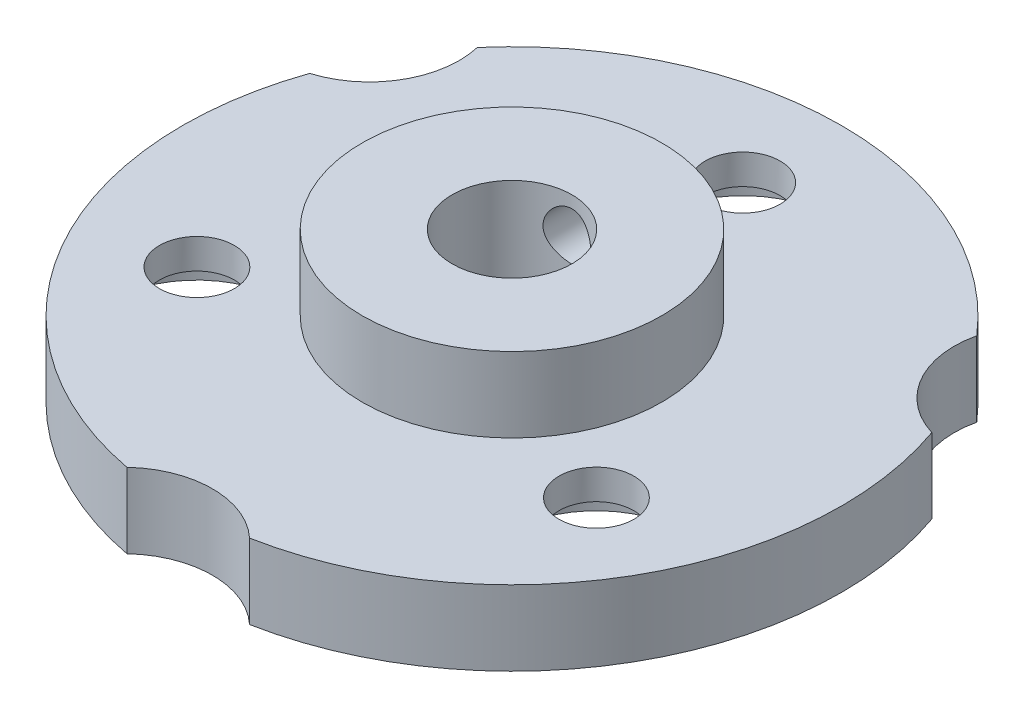
ISO-10303-21;
HEADER;
FILE_DESCRIPTION(('STEP AP214'),'2;1');
FILE_NAME('part.step','',(''),(''),'','','');
FILE_SCHEMA(('AUTOMOTIVE_DESIGN { 1 0 10303 214 1 1 1 1 }'));
ENDSEC;
DATA;
#1=APPLICATION_CONTEXT('core data for automotive mechanical design processes');
#2=APPLICATION_PROTOCOL_DEFINITION('international standard','automotive_design',2000,#1);
#3=PRODUCT_CONTEXT('',#1,'mechanical');
#4=PRODUCT('Part','Part','',(#3));
#5=PRODUCT_RELATED_PRODUCT_CATEGORY('part','',(#4));
#6=PRODUCT_DEFINITION_FORMATION('','',#4);
#7=PRODUCT_DEFINITION_CONTEXT('part definition',#1,'design');
#8=PRODUCT_DEFINITION('design','',#6,#7);
#9=PRODUCT_DEFINITION_SHAPE('','',#8);
#10=(LENGTH_UNIT() NAMED_UNIT(*) SI_UNIT(.MILLI.,.METRE.));
#11=(NAMED_UNIT(*) PLANE_ANGLE_UNIT() SI_UNIT($,.RADIAN.));
#12=(NAMED_UNIT(*) SI_UNIT($,.STERADIAN.) SOLID_ANGLE_UNIT());
#13=UNCERTAINTY_MEASURE_WITH_UNIT(LENGTH_MEASURE(1.E-05),#10,'distance_accuracy_value','');
#14=(GEOMETRIC_REPRESENTATION_CONTEXT(3) GLOBAL_UNCERTAINTY_ASSIGNED_CONTEXT((#13)) GLOBAL_UNIT_ASSIGNED_CONTEXT((#10,
#11,#12)) REPRESENTATION_CONTEXT('',''));
#15=CARTESIAN_POINT('',(0.,0.,0.));
#16=DIRECTION('',(0.,0.,1.));
#17=DIRECTION('',(1.,0.,0.));
#18=AXIS2_PLACEMENT_3D('',#15,#16,#17);
#19=CARTESIAN_POINT('',(0.,0.,-7.7));
#20=DIRECTION('',(0.,1.,0.));
#21=DIRECTION('',(0.,0.,1.));
#22=AXIS2_PLACEMENT_3D('',#19,#20,#21);
#23=CYLINDRICAL_SURFACE('',#22,1.25);
#24=CARTESIAN_POINT('',(0.,2.5,-7.7));
#25=DIRECTION('',(0.,1.,0.));
#26=DIRECTION('',(0.,0.,1.));
#27=AXIS2_PLACEMENT_3D('',#24,#25,#26);
#28=CIRCLE('',#27,1.25);
#29=CARTESIAN_POINT('',(0.,2.5,-6.45));
#30=VERTEX_POINT('',#29);
#31=EDGE_CURVE('E256',#30,#30,#28,.T.);
#32=ORIENTED_EDGE('',*,*,#31,.T.);
#33=EDGE_LOOP('',(#32));
#34=FACE_BOUND('',#33,.T.);
#35=CARTESIAN_POINT('',(0.,1.5,-7.7));
#36=DIRECTION('',(0.,-1.,0.));
#37=DIRECTION('',(0.,0.,-1.));
#38=AXIS2_PLACEMENT_3D('',#35,#36,#37);
#39=CIRCLE('',#38,1.25);
#40=CARTESIAN_POINT('',(0.,1.5,-8.95));
#41=VERTEX_POINT('',#40);
#42=EDGE_CURVE('E37',#41,#41,#39,.F.);
#43=ORIENTED_EDGE('',*,*,#42,.F.);
#44=EDGE_LOOP('',(#43));
#45=FACE_BOUND('',#44,.T.);
#46=ADVANCED_FACE('F33',(#34,#45),#23,.F.);
#47=CARTESIAN_POINT('',(-6.66839560914018,0.,3.85));
#48=DIRECTION('',(0.,1.,0.));
#49=DIRECTION('',(0.,0.,1.));
#50=AXIS2_PLACEMENT_3D('',#47,#48,#49);
#51=CYLINDRICAL_SURFACE('',#50,1.25);
#52=CARTESIAN_POINT('',(-6.66839560914018,2.5,3.85));
#53=DIRECTION('',(0.,1.,0.));
#54=DIRECTION('',(0.,0.,1.));
#55=AXIS2_PLACEMENT_3D('',#52,#53,#54);
#56=CIRCLE('',#55,1.25);
#57=CARTESIAN_POINT('',(-6.66839560914018,2.5,5.1));
#58=VERTEX_POINT('',#57);
#59=EDGE_CURVE('E260',#58,#58,#56,.T.);
#60=ORIENTED_EDGE('',*,*,#59,.T.);
#61=EDGE_LOOP('',(#60));
#62=FACE_BOUND('',#61,.T.);
#63=CARTESIAN_POINT('',(-6.66839560914018,1.5,3.85));
#64=DIRECTION('',(0.,-1.,0.));
#65=DIRECTION('',(0.,0.,-1.));
#66=AXIS2_PLACEMENT_3D('',#63,#64,#65);
#67=CIRCLE('',#66,1.25);
#68=CARTESIAN_POINT('',(-6.66839560914018,1.5,2.6));
#69=VERTEX_POINT('',#68);
#70=EDGE_CURVE('E127',#69,#69,#67,.F.);
#71=ORIENTED_EDGE('',*,*,#70,.F.);
#72=EDGE_LOOP('',(#71));
#73=FACE_BOUND('',#72,.T.);
#74=ADVANCED_FACE('F218',(#62,#73),#51,.F.);
#75=CARTESIAN_POINT('',(6.66839560914018,0.,3.85));
#76=DIRECTION('',(0.,1.,0.));
#77=DIRECTION('',(0.,0.,1.));
#78=AXIS2_PLACEMENT_3D('',#75,#76,#77);
#79=CYLINDRICAL_SURFACE('',#78,1.25);
#80=CARTESIAN_POINT('',(6.66839560914018,2.5,3.85));
#81=DIRECTION('',(0.,1.,0.));
#82=DIRECTION('',(0.,0.,1.));
#83=AXIS2_PLACEMENT_3D('',#80,#81,#82);
#84=CIRCLE('',#83,1.25);
#85=CARTESIAN_POINT('',(6.66839560914018,2.5,5.1));
#86=VERTEX_POINT('',#85);
#87=EDGE_CURVE('E257',#86,#86,#84,.T.);
#88=ORIENTED_EDGE('',*,*,#87,.T.);
#89=EDGE_LOOP('',(#88));
#90=FACE_BOUND('',#89,.T.);
#91=CARTESIAN_POINT('',(6.66839560914018,1.5,3.85));
#92=DIRECTION('',(0.,-1.,0.));
#93=DIRECTION('',(0.,0.,-1.));
#94=AXIS2_PLACEMENT_3D('',#91,#92,#93);
#95=CIRCLE('',#94,1.25);
#96=CARTESIAN_POINT('',(6.66839560914018,1.5,2.6));
#97=VERTEX_POINT('',#96);
#98=EDGE_CURVE('E103',#97,#97,#95,.F.);
#99=ORIENTED_EDGE('',*,*,#98,.F.);
#100=EDGE_LOOP('',(#99));
#101=FACE_BOUND('',#100,.T.);
#102=ADVANCED_FACE('F224',(#90,#101),#79,.F.);
#103=CARTESIAN_POINT('',(0.,2.5,0.));
#104=DIRECTION('',(0.,-1.,0.));
#105=DIRECTION('',(0.,0.,-1.));
#106=AXIS2_PLACEMENT_3D('',#103,#104,#105);
#107=CYLINDRICAL_SURFACE('',#106,11.);
#108=CARTESIAN_POINT('',(0.,0.,0.));
#109=DIRECTION('',(0.,1.,0.));
#110=DIRECTION('',(0.,0.,1.));
#111=AXIS2_PLACEMENT_3D('',#108,#109,#110);
#112=CIRCLE('',#111,11.);
#113=CARTESIAN_POINT('',(2.04787377107266,0.,10.8076923076924));
#114=VERTEX_POINT('',#113);
#115=CARTESIAN_POINT('',(10.3836729802836,0.,-3.63033544435343));
#116=VERTEX_POINT('',#115);
#117=EDGE_CURVE('E112',#114,#116,#112,.T.);
#118=ORIENTED_EDGE('',*,*,#117,.T.);
#119=DIRECTION('',(0.,1.,0.));
#120=VECTOR('',#119,1.);
#121=CARTESIAN_POINT('',(10.3836729802836,-0.25,-3.63033544435342));
#122=LINE('',#121,#120);
#123=CARTESIAN_POINT('',(10.3836729802836,2.5,-3.63033544435342));
#124=VERTEX_POINT('',#123);
#125=EDGE_CURVE('E50',#116,#124,#122,.T.);
#126=ORIENTED_EDGE('',*,*,#125,.T.);
#127=CARTESIAN_POINT('',(0.,2.5,0.));
#128=DIRECTION('',(0.,1.,0.));
#129=DIRECTION('',(0.,0.,1.));
#130=AXIS2_PLACEMENT_3D('',#127,#128,#129);
#131=CIRCLE('',#130,11.);
#132=CARTESIAN_POINT('',(2.04787377107267,2.5,10.8076923076924));
#133=VERTEX_POINT('',#132);
#134=EDGE_CURVE('E102',#133,#124,#131,.T.);
#135=ORIENTED_EDGE('',*,*,#134,.F.);
#136=DIRECTION('',(0.,1.,0.));
#137=VECTOR('',#136,1.);
#138=CARTESIAN_POINT('',(2.04787377107266,-0.25,10.8076923076924));
#139=LINE('',#138,#137);
#140=EDGE_CURVE('E151',#133,#114,#139,.F.);
#141=ORIENTED_EDGE('',*,*,#140,.T.);
#142=EDGE_LOOP('',(#118,#126,#135,#141));
#143=FACE_BOUND('',#142,.T.);
#144=ADVANCED_FACE('F243',(#143),#107,.T.);
#145=CARTESIAN_POINT('',(-10.3836729802836,0.,-3.6303354443534));
#146=VERTEX_POINT('',#145);
#147=CARTESIAN_POINT('',(-2.04787377107266,0.,10.8076923076924));
#148=VERTEX_POINT('',#147);
#149=EDGE_CURVE('E108',#146,#148,#112,.T.);
#150=ORIENTED_EDGE('',*,*,#149,.T.);
#151=DIRECTION('',(0.,1.,0.));
#152=VECTOR('',#151,1.);
#153=CARTESIAN_POINT('',(-2.04787377107266,-0.25,10.8076923076924));
#154=LINE('',#153,#152);
#155=CARTESIAN_POINT('',(-2.04787377107267,2.5,10.8076923076924));
#156=VERTEX_POINT('',#155);
#157=EDGE_CURVE('E57',#148,#156,#154,.T.);
#158=ORIENTED_EDGE('',*,*,#157,.T.);
#159=CARTESIAN_POINT('',(-10.3836729802836,2.5,-3.63033544435341));
#160=VERTEX_POINT('',#159);
#161=EDGE_CURVE('E110',#160,#156,#131,.T.);
#162=ORIENTED_EDGE('',*,*,#161,.F.);
#163=DIRECTION('',(0.,1.,0.));
#164=VECTOR('',#163,1.);
#165=CARTESIAN_POINT('',(-10.3836729802836,-0.25,-3.63033544435341));
#166=LINE('',#165,#164);
#167=EDGE_CURVE('E157',#160,#146,#166,.F.);
#168=ORIENTED_EDGE('',*,*,#167,.T.);
#169=EDGE_LOOP('',(#150,#158,#162,#168));
#170=FACE_BOUND('',#169,.T.);
#171=ADVANCED_FACE('F232',(#170),#107,.T.);
#172=CARTESIAN_POINT('',(0.,2.5,0.));
#173=DIRECTION('',(0.,1.,0.));
#174=DIRECTION('',(0.,0.,1.));
#175=AXIS2_PLACEMENT_3D('',#172,#173,#174);
#176=PLANE('',#175);
#177=CARTESIAN_POINT('',(11.258330249198,2.5,-6.50000000000016));
#178=DIRECTION('',(0.,1.,0.));
#179=DIRECTION('',(0.,0.,1.));
#180=AXIS2_PLACEMENT_3D('',#177,#178,#179);
#181=CIRCLE('',#180,3.);
#182=CARTESIAN_POINT('',(8.33579920921091,2.5,-7.17735686333895));
#183=VERTEX_POINT('',#182);
#184=EDGE_CURVE('E88',#183,#124,#181,.T.);
#185=ORIENTED_EDGE('',*,*,#184,.F.);
#186=CARTESIAN_POINT('',(-8.33579920921092,2.5,-7.17735686333894));
#187=VERTEX_POINT('',#186);
#188=EDGE_CURVE('E98',#183,#187,#131,.T.);
#189=ORIENTED_EDGE('',*,*,#188,.T.);
#190=CARTESIAN_POINT('',(-11.258330249198,2.5,-6.50000000000015));
#191=DIRECTION('',(0.,1.,0.));
#192=DIRECTION('',(0.,0.,1.));
#193=AXIS2_PLACEMENT_3D('',#190,#191,#192);
#194=CIRCLE('',#193,3.);
#195=EDGE_CURVE('E155',#160,#187,#194,.T.);
#196=ORIENTED_EDGE('',*,*,#195,.F.);
#197=ORIENTED_EDGE('',*,*,#161,.T.);
#198=CARTESIAN_POINT('',(0.,2.5,13.0000000000003));
#199=DIRECTION('',(0.,1.,0.));
#200=DIRECTION('',(0.,0.,1.));
#201=AXIS2_PLACEMENT_3D('',#198,#199,#200);
#202=CIRCLE('',#201,3.);
#203=EDGE_CURVE('E149',#133,#156,#202,.T.);
#204=ORIENTED_EDGE('',*,*,#203,.F.);
#205=ORIENTED_EDGE('',*,*,#134,.T.);
#206=EDGE_LOOP('',(#185,#189,#196,#197,#204,#205));
#207=FACE_BOUND('',#206,.T.);
#208=ORIENTED_EDGE('',*,*,#31,.F.);
#209=EDGE_LOOP('',(#208));
#210=FACE_BOUND('',#209,.T.);
#211=ORIENTED_EDGE('',*,*,#87,.F.);
#212=EDGE_LOOP('',(#211));
#213=FACE_BOUND('',#212,.T.);
#214=ORIENTED_EDGE('',*,*,#59,.F.);
#215=EDGE_LOOP('',(#214));
#216=FACE_BOUND('',#215,.T.);
#217=CARTESIAN_POINT('',(0.,2.5,0.));
#218=DIRECTION('',(0.,1.,0.));
#219=DIRECTION('',(0.,0.,1.));
#220=AXIS2_PLACEMENT_3D('',#217,#218,#219);
#221=CIRCLE('',#220,5.);
#222=CARTESIAN_POINT('',(0.,2.5,5.));
#223=VERTEX_POINT('',#222);
#224=EDGE_CURVE('E266',#223,#223,#221,.T.);
#225=ORIENTED_EDGE('',*,*,#224,.F.);
#226=EDGE_LOOP('',(#225));
#227=FACE_BOUND('',#226,.T.);
#228=ADVANCED_FACE('F95',(#207,#210,#213,#216,#227),#176,.T.);
#229=ORIENTED_EDGE('',*,*,#188,.F.);
#230=DIRECTION('',(0.,1.,0.));
#231=VECTOR('',#230,1.);
#232=CARTESIAN_POINT('',(8.33579920921091,-0.25,-7.17735686333894));
#233=LINE('',#232,#231);
#234=CARTESIAN_POINT('',(8.33579920921092,0.,-7.17735686333894));
#235=VERTEX_POINT('',#234);
#236=EDGE_CURVE('E85',#183,#235,#233,.F.);
#237=ORIENTED_EDGE('',*,*,#236,.T.);
#238=CARTESIAN_POINT('',(-8.33579920921091,0.,-7.17735686333895));
#239=VERTEX_POINT('',#238);
#240=EDGE_CURVE('E114',#235,#239,#112,.T.);
#241=ORIENTED_EDGE('',*,*,#240,.T.);
#242=DIRECTION('',(0.,1.,0.));
#243=VECTOR('',#242,1.);
#244=CARTESIAN_POINT('',(-8.33579920921092,-0.25,-7.17735686333895));
#245=LINE('',#244,#243);
#246=EDGE_CURVE('E107',#239,#187,#245,.T.);
#247=ORIENTED_EDGE('',*,*,#246,.T.);
#248=EDGE_LOOP('',(#229,#237,#241,#247));
#249=FACE_BOUND('',#248,.T.);
#250=ADVANCED_FACE('F35',(#249),#107,.T.);
#251=CARTESIAN_POINT('',(0.,0.,0.));
#252=DIRECTION('',(0.,1.,0.));
#253=DIRECTION('',(0.,0.,1.));
#254=AXIS2_PLACEMENT_3D('',#251,#252,#253);
#255=PLANE('',#254);
#256=CARTESIAN_POINT('',(0.,0.,-7.7));
#257=DIRECTION('',(0.,-1.,0.));
#258=DIRECTION('',(0.,0.,-1.));
#259=AXIS2_PLACEMENT_3D('',#256,#257,#258);
#260=CIRCLE('',#259,3.);
#261=CARTESIAN_POINT('',(0.,0.,-10.7));
#262=VERTEX_POINT('',#261);
#263=EDGE_CURVE('E143',#262,#262,#260,.T.);
#264=ORIENTED_EDGE('',*,*,#263,.F.);
#265=EDGE_LOOP('',(#264));
#266=FACE_BOUND('',#265,.T.);
#267=CARTESIAN_POINT('',(-6.66839560914018,0.,3.85));
#268=DIRECTION('',(0.,-1.,0.));
#269=DIRECTION('',(0.,0.,-1.));
#270=AXIS2_PLACEMENT_3D('',#267,#268,#269);
#271=CIRCLE('',#270,3.);
#272=CARTESIAN_POINT('',(-6.66839560914018,0.,0.850000000000001));
#273=VERTEX_POINT('',#272);
#274=EDGE_CURVE('E136',#273,#273,#271,.T.);
#275=ORIENTED_EDGE('',*,*,#274,.F.);
#276=EDGE_LOOP('',(#275));
#277=FACE_BOUND('',#276,.T.);
#278=CARTESIAN_POINT('',(6.66839560914018,0.,3.85));
#279=DIRECTION('',(0.,-1.,0.));
#280=DIRECTION('',(0.,0.,-1.));
#281=AXIS2_PLACEMENT_3D('',#278,#279,#280);
#282=CIRCLE('',#281,3.);
#283=CARTESIAN_POINT('',(6.66839560914018,0.,0.849999999999996));
#284=VERTEX_POINT('',#283);
#285=EDGE_CURVE('E129',#284,#284,#282,.T.);
#286=ORIENTED_EDGE('',*,*,#285,.F.);
#287=EDGE_LOOP('',(#286));
#288=FACE_BOUND('',#287,.T.);
#289=CARTESIAN_POINT('',(0.,0.,0.));
#290=DIRECTION('',(0.,1.,0.));
#291=DIRECTION('',(0.,0.,1.));
#292=AXIS2_PLACEMENT_3D('',#289,#290,#291);
#293=CIRCLE('',#292,2.);
#294=CARTESIAN_POINT('',(0.,0.,2.));
#295=VERTEX_POINT('',#294);
#296=EDGE_CURVE('E253',#295,#295,#293,.T.);
#297=ORIENTED_EDGE('',*,*,#296,.T.);
#298=EDGE_LOOP('',(#297));
#299=FACE_BOUND('',#298,.T.);
#300=ORIENTED_EDGE('',*,*,#240,.F.);
#301=CARTESIAN_POINT('',(11.258330249198,0.,-6.50000000000016));
#302=DIRECTION('',(0.,1.,0.));
#303=DIRECTION('',(0.,0.,1.));
#304=AXIS2_PLACEMENT_3D('',#301,#302,#303);
#305=CIRCLE('',#304,3.);
#306=EDGE_CURVE('E11',#235,#116,#305,.T.);
#307=ORIENTED_EDGE('',*,*,#306,.T.);
#308=ORIENTED_EDGE('',*,*,#117,.F.);
#309=CARTESIAN_POINT('',(0.,0.,13.0000000000003));
#310=DIRECTION('',(0.,1.,0.));
#311=DIRECTION('',(0.,0.,1.));
#312=AXIS2_PLACEMENT_3D('',#309,#310,#311);
#313=CIRCLE('',#312,3.);
#314=EDGE_CURVE('E42',#114,#148,#313,.T.);
#315=ORIENTED_EDGE('',*,*,#314,.T.);
#316=ORIENTED_EDGE('',*,*,#149,.F.);
#317=CARTESIAN_POINT('',(-11.258330249198,0.,-6.50000000000015));
#318=DIRECTION('',(0.,1.,0.));
#319=DIRECTION('',(0.,0.,1.));
#320=AXIS2_PLACEMENT_3D('',#317,#318,#319);
#321=CIRCLE('',#320,3.);
#322=EDGE_CURVE('E117',#146,#239,#321,.T.);
#323=ORIENTED_EDGE('',*,*,#322,.T.);
#324=EDGE_LOOP('',(#300,#307,#308,#315,#316,#323));
#325=FACE_BOUND('',#324,.T.);
#326=ADVANCED_FACE('F233',(#266,#277,#288,#299,#325),#255,.F.);
#327=CARTESIAN_POINT('',(0.,5.,0.));
#328=DIRECTION('',(0.,-1.,0.));
#329=DIRECTION('',(0.,0.,-1.));
#330=AXIS2_PLACEMENT_3D('',#327,#328,#329);
#331=CYLINDRICAL_SURFACE('',#330,5.);
#332=CARTESIAN_POINT('',(0.,4.59295521709407,-5.));
#333=CARTESIAN_POINT('',(-0.0446345464348316,4.59280840972483,-4.99999925421206));
#334=CARTESIAN_POINT('',(-0.0892819443510242,4.58891705369241,-4.9993960875234));
#335=CARTESIAN_POINT('',(-0.177301891678728,4.57375034444032,-4.99704993433986));
#336=CARTESIAN_POINT('',(-0.220673197606512,4.56246802289334,-4.99530587219164));
#337=CARTESIAN_POINT('',(-0.304854977903623,4.53286726162526,-4.99087558705497));
#338=CARTESIAN_POINT('',(-0.345667459361672,4.51455441889718,-4.98819011367073));
#339=CARTESIAN_POINT('',(-0.423635297501168,4.47142634078325,-4.98217463731942));
#340=CARTESIAN_POINT('',(-0.460791109846802,4.44661191698616,-4.97884471481213));
#341=CARTESIAN_POINT('',(-0.530725668288756,4.39095066663555,-4.97187860497349));
#342=CARTESIAN_POINT('',(-0.563467348194365,4.36005754142336,-4.96824019736804));
#343=CARTESIAN_POINT('',(-0.623325168104831,4.29321676146511,-4.96108624127247));
#344=CARTESIAN_POINT('',(-0.65044097100112,4.25726880404452,-4.95757070015512));
#345=CARTESIAN_POINT('',(-0.698418461816593,4.18109293926852,-4.95104061891818));
#346=CARTESIAN_POINT('',(-0.719244831066636,4.1408425198778,-4.94802894895029));
#347=CARTESIAN_POINT('',(-0.753826505269509,4.0573583918758,-4.9428790397377));
#348=CARTESIAN_POINT('',(-0.767582254949823,4.01412487108954,-4.94074074556118));
#349=CARTESIAN_POINT('',(-0.787517076478005,3.9262960935183,-4.93760253956309));
#350=CARTESIAN_POINT('',(-0.793760297058812,3.88171574712982,-4.93659299479914));
#351=CARTESIAN_POINT('',(-0.798690889447807,3.79212975820018,-4.93579776042976));
#352=CARTESIAN_POINT('',(-0.797378748811149,3.74712414328914,-4.9360119918528));
#353=CARTESIAN_POINT('',(-0.787288858704428,3.65841063797979,-4.93763113481972));
#354=CARTESIAN_POINT('',(-0.778581283745994,3.61469453280229,-4.93902485388638));
#355=CARTESIAN_POINT('',(-0.754056623447392,3.52935153996084,-4.94282826426096));
#356=CARTESIAN_POINT('',(-0.738239305621584,3.48772472066515,-4.94523798879167));
#357=CARTESIAN_POINT('',(-0.699868024192296,3.40752234623804,-4.95081411790351));
#358=CARTESIAN_POINT('',(-0.677283485215569,3.36896166684932,-4.9539839434747));
#359=CARTESIAN_POINT('',(-0.626041212269116,3.29614996590887,-4.9607195182505));
#360=CARTESIAN_POINT('',(-0.597383026549834,3.26189926522965,-4.96428529689616));
#361=CARTESIAN_POINT('',(-0.534418967683776,3.19827161328361,-4.97145948250141));
#362=CARTESIAN_POINT('',(-0.50005254880277,3.16895454552508,-4.97506791289196));
#363=CARTESIAN_POINT('',(-0.42685535233901,3.1164946643916,-4.98188150665978));
#364=CARTESIAN_POINT('',(-0.38802455481584,3.09335187859599,-4.98508666823568));
#365=CARTESIAN_POINT('',(-0.306953152851501,3.05389666610303,-4.99073439993172));
#366=CARTESIAN_POINT('',(-0.264710579067384,3.03758821841365,-4.99317652559617));
#367=CARTESIAN_POINT('',(-0.178038476907495,3.0123135850691,-4.99701733008075));
#368=CARTESIAN_POINT('',(-0.13360911778908,3.00334683211061,-4.99841608952256));
#369=CARTESIAN_POINT('',(-0.044342834257701,2.99308885599945,-5.00000045238604));
#370=CARTESIAN_POINT('',(0.000484388161033505,2.99171513888676,-5.00019909658237));
#371=CARTESIAN_POINT('',(0.0897277032897241,2.99646392886732,-4.99939398406668));
#372=CARTESIAN_POINT('',(0.134143810122924,3.00258617747796,-4.99839026881552));
#373=CARTESIAN_POINT('',(0.22105882533659,3.02208504347061,-4.99529929653219));
#374=CARTESIAN_POINT('',(0.263566806501662,3.03542223188221,-4.99321793138338));
#375=CARTESIAN_POINT('',(0.345743289629188,3.06893109522977,-4.98820186778873));
#376=CARTESIAN_POINT('',(0.385411640694738,3.08910313304104,-4.98526712403657));
#377=CARTESIAN_POINT('',(0.461145134721015,3.13590295965188,-4.97883553280157));
#378=CARTESIAN_POINT('',(0.497177643904882,3.16258293348531,-4.97533422270727));
#379=CARTESIAN_POINT('',(0.564283089849041,3.22156791963511,-4.9681712513089));
#380=CARTESIAN_POINT('',(0.5953556984032,3.25387330390017,-4.9645095794138));
#381=CARTESIAN_POINT('',(0.651957795364867,3.3235577117943,-4.9573959412819));
#382=CARTESIAN_POINT('',(0.677432262603727,3.36098169719568,-4.95394627756548));
#383=CARTESIAN_POINT('',(0.721732833216672,3.43962673186725,-4.9476867714127));
#384=CARTESIAN_POINT('',(0.740559142226743,3.48084766364334,-4.94487690918741));
#385=CARTESIAN_POINT('',(0.770943170127828,3.56575058190925,-4.94023112007101));
#386=CARTESIAN_POINT('',(0.782530149288916,3.60942187342313,-4.93839127728325));
#387=CARTESIAN_POINT('',(0.798199803671995,3.69812236414841,-4.93588301608632));
#388=CARTESIAN_POINT('',(0.80228307355758,3.74315145546765,-4.93521450485016));
#389=CARTESIAN_POINT('',(0.802815962429547,3.83273817599765,-4.93512779371066));
#390=CARTESIAN_POINT('',(0.799352463469281,3.87729529912648,-4.93569536340789));
#391=CARTESIAN_POINT('',(0.785075890692146,3.96518430315666,-4.93798615841887));
#392=CARTESIAN_POINT('',(0.774262828172747,4.00851618594129,-4.93970938195619));
#393=CARTESIAN_POINT('',(0.745624187596051,4.09270216575181,-4.94411292837317));
#394=CARTESIAN_POINT('',(0.72780443654043,4.1335582892027,-4.94679245578731));
#395=CARTESIAN_POINT('',(0.685666554935636,4.21171525048427,-4.9528085340871));
#396=CARTESIAN_POINT('',(0.661348141854871,4.24901593364528,-4.95614511353666));
#397=CARTESIAN_POINT('',(0.606587081465112,4.3194447098727,-4.96314620762862));
#398=CARTESIAN_POINT('',(0.576080086044314,4.3525224588935,-4.9668139223735));
#399=CARTESIAN_POINT('',(0.509945409149723,4.41311877418437,-4.97403858748415));
#400=CARTESIAN_POINT('',(0.474316548786267,4.44063605709539,-4.97759551211962));
#401=CARTESIAN_POINT('',(0.398688189514486,4.48948390134341,-4.98422474154444));
#402=CARTESIAN_POINT('',(0.358663017320115,4.51077513877548,-4.98729391237595));
#403=CARTESIAN_POINT('',(0.275572401990431,4.54629917536374,-4.99257309312883));
#404=CARTESIAN_POINT('',(0.232510090751467,4.56053912765659,-4.9947839732444));
#405=CARTESIAN_POINT('',(0.157722389070858,4.57841711433275,-4.99760747858701));
#406=CARTESIAN_POINT('',(0.12644710954531,4.58395060419822,-4.99850013479712));
#407=CARTESIAN_POINT('',(0.0634500468027396,4.59127180597416,-4.99969665612681));
#408=CARTESIAN_POINT('',(0.0317282703374389,4.59305957446456,-5.00000053014007));
#409=CARTESIAN_POINT('',(0.,4.59295521709407,-5.));
#410=B_SPLINE_CURVE_WITH_KNOTS('',3,(#332,#333,#334,#335,#336,#337,#338,#339,#340,#341,#342,
#343,#344,#345,#346,#347,#348,#349,#350,#351,#352,#353,#354,#355,#356,#357,#358,#359,#360,#361,
#362,#363,#364,#365,#366,#367,#368,#369,#370,#371,#372,#373,#374,#375,#376,#377,#378,#379,#380,
#381,#382,#383,#384,#385,#386,#387,#388,#389,#390,#391,#392,#393,#394,#395,#396,#397,#398,#399,
#400,#401,#402,#403,#404,#405,#406,#407,#408,#409),.UNSPECIFIED.,.T.,.F.,(4,2,2,2,2,2,2,2,2,2,2,
2,2,2,2,2,2,2,2,2,2,2,2,2,2,2,2,2,2,2,2,2,2,2,2,2,2,2,4),(0.,0.13378838513054,0.267703090104947,
0.401511406008695,0.53530302664602,0.67015614056743,0.805017332699413,0.940622335585658,
1.07621880815102,1.21064902767123,1.34507057236969,1.47823067492863,1.61139513208443,
1.74517055974791,1.87895594093933,2.0142634358785,2.1495715352002,2.28495830293329,
2.42033460814825,2.5542371933749,2.68813516138256,2.82130867464519,2.9544892594542,
3.08877506801447,3.22306975884367,3.35863055099062,3.49418714970259,3.62919224330306,
3.76418663738493,3.89763512942673,4.03108341633702,4.16442095702511,4.2977642955525,
4.43257259927339,4.56741198138661,4.70308547687108,4.83862105572566,4.93372537539903,
5.02882825849047),.UNSPECIFIED.);
#411=CARTESIAN_POINT('',(0.,4.59295521709407,-5.));
#412=VERTEX_POINT('',#411);
#413=EDGE_CURVE('E168',#412,#412,#410,.T.);
#414=ORIENTED_EDGE('',*,*,#413,.T.);
#415=EDGE_LOOP('',(#414));
#416=FACE_BOUND('',#415,.T.);
#417=CARTESIAN_POINT('',(0.,5.,0.));
#418=DIRECTION('',(0.,1.,0.));
#419=DIRECTION('',(0.,0.,1.));
#420=AXIS2_PLACEMENT_3D('',#417,#418,#419);
#421=CIRCLE('',#420,5.);
#422=CARTESIAN_POINT('',(0.,5.,5.));
#423=VERTEX_POINT('',#422);
#424=EDGE_CURVE('E265',#423,#423,#421,.T.);
#425=ORIENTED_EDGE('',*,*,#424,.F.);
#426=EDGE_LOOP('',(#425));
#427=FACE_BOUND('',#426,.T.);
#428=ORIENTED_EDGE('',*,*,#224,.T.);
#429=EDGE_LOOP('',(#428));
#430=FACE_BOUND('',#429,.T.);
#431=ADVANCED_FACE('F235',(#416,#427,#430),#331,.T.);
#432=CARTESIAN_POINT('',(0.,5.,0.));
#433=DIRECTION('',(0.,1.,0.));
#434=DIRECTION('',(0.,0.,1.));
#435=AXIS2_PLACEMENT_3D('',#432,#433,#434);
#436=PLANE('',#435);
#437=CARTESIAN_POINT('',(0.,5.,0.));
#438=DIRECTION('',(0.,1.,0.));
#439=DIRECTION('',(0.,0.,1.));
#440=AXIS2_PLACEMENT_3D('',#437,#438,#439);
#441=CIRCLE('',#440,2.);
#442=CARTESIAN_POINT('',(0.,5.,2.));
#443=VERTEX_POINT('',#442);
#444=EDGE_CURVE('E271',#443,#443,#441,.T.);
#445=ORIENTED_EDGE('',*,*,#444,.F.);
#446=EDGE_LOOP('',(#445));
#447=FACE_BOUND('',#446,.T.);
#448=ORIENTED_EDGE('',*,*,#424,.T.);
#449=EDGE_LOOP('',(#448));
#450=FACE_BOUND('',#449,.T.);
#451=ADVANCED_FACE('F241',(#447,#450),#436,.T.);
#452=CARTESIAN_POINT('',(0.,-0.5,0.));
#453=DIRECTION('',(0.,1.,0.));
#454=DIRECTION('',(0.,0.,1.));
#455=AXIS2_PLACEMENT_3D('',#452,#453,#454);
#456=CYLINDRICAL_SURFACE('',#455,2.);
#457=CARTESIAN_POINT('',(-0.799047163232818,3.79295943814312,-1.83344583528655));
#458=CARTESIAN_POINT('',(-0.799042462665129,3.83581523738308,-1.83345016148733));
#459=CARTESIAN_POINT('',(-0.795582298961549,3.878731652025,-1.83496816656248));
#460=CARTESIAN_POINT('',(-0.781870924640441,3.96333337129395,-1.84085028760057));
#461=CARTESIAN_POINT('',(-0.771602360737395,4.00501524497531,-1.84522167583811));
#462=CARTESIAN_POINT('',(-0.744729327155326,4.08578061493114,-1.85622915151898));
#463=CARTESIAN_POINT('',(-0.728148728191182,4.12487325708722,-1.86285669680964));
#464=CARTESIAN_POINT('',(-0.689192297844297,4.19971345848697,-1.87761712591288));
#465=CARTESIAN_POINT('',(-0.666817731835192,4.23546174580346,-1.88574968092829));
#466=CARTESIAN_POINT('',(-0.61553971281123,4.3046635990397,-1.90312364779918));
#467=CARTESIAN_POINT('',(-0.58635784032435,4.33790200731491,-1.91240069322624));
#468=CARTESIAN_POINT('',(-0.522880208430892,4.39917103706927,-1.93072185889342));
#469=CARTESIAN_POINT('',(-0.488582669464804,4.42719983865906,-1.93976589678943));
#470=CARTESIAN_POINT('',(-0.414185402195358,4.4783219969362,-1.95702917136805));
#471=CARTESIAN_POINT('',(-0.373910211072265,4.50117715873138,-1.96520182230166));
#472=CARTESIAN_POINT('',(-0.289701380398092,4.53969686549904,-1.97936655195159));
#473=CARTESIAN_POINT('',(-0.245769238148499,4.5553643364559,-1.9853595177737));
#474=CARTESIAN_POINT('',(-0.157750075902051,4.57829603271808,-1.99423556096864));
#475=CARTESIAN_POINT('',(-0.113773523697688,4.58593036377873,-1.99725515136257));
#476=CARTESIAN_POINT('',(-0.0250668487170981,4.5937708324082,-2.00033454157052));
#477=CARTESIAN_POINT('',(0.0196629867650228,4.59397974051706,-2.00039544531936));
#478=CARTESIAN_POINT('',(0.105931294208234,4.58716633023313,-1.99763306267521));
#479=CARTESIAN_POINT('',(0.147507899770072,4.58054952904435,-1.99497158842065));
#480=CARTESIAN_POINT('',(0.228902174751906,4.56096228761882,-1.98727846099662));
#481=CARTESIAN_POINT('',(0.268719714875988,4.54799138118296,-1.98224663391601));
#482=CARTESIAN_POINT('',(0.346183249643455,4.5159048449926,-1.97020763308979));
#483=CARTESIAN_POINT('',(0.383787471768839,4.49669955221691,-1.96317183115119));
#484=CARTESIAN_POINT('',(0.455335714177723,4.45277343537552,-1.94782194029242));
#485=CARTESIAN_POINT('',(0.489278474026521,4.42805072090407,-1.93950741355362));
#486=CARTESIAN_POINT('',(0.554906472629294,4.37189978376448,-1.92179839226061));
#487=CARTESIAN_POINT('',(0.5862971827107,4.34013788110959,-1.91236883284082));
#488=CARTESIAN_POINT('',(0.643427425666816,4.27176320941473,-1.89391247433249));
#489=CARTESIAN_POINT('',(0.669165108827851,4.23514885888145,-1.88488580784111));
#490=CARTESIAN_POINT('',(0.714932684947926,4.15679182917954,-1.86801625144648));
#491=CARTESIAN_POINT('',(0.734780817558316,4.11493350594959,-1.86021400116244));
#492=CARTESIAN_POINT('',(0.767030676121989,4.02807324195832,-1.84715194248046));
#493=CARTESIAN_POINT('',(0.779437238497369,3.98307336423478,-1.8418904832071));
#494=CARTESIAN_POINT('',(0.795735790485013,3.8941451271687,-1.83490569798837));
#495=CARTESIAN_POINT('',(0.800101652415495,3.85031925929505,-1.83298585564763));
#496=CARTESIAN_POINT('',(0.801577009622713,3.76252855503594,-1.83234161445076));
#497=CARTESIAN_POINT('',(0.798688705387978,3.71856376483198,-1.83361624657819));
#498=CARTESIAN_POINT('',(0.786169103831121,3.63437586416117,-1.83901580962576));
#499=CARTESIAN_POINT('',(0.776931226908908,3.59408226318332,-1.84297426536607));
#500=CARTESIAN_POINT('',(0.752484930936957,3.51564407622872,-1.85308934576475));
#501=CARTESIAN_POINT('',(0.737275188035647,3.4774999689002,-1.85924645779688));
#502=CARTESIAN_POINT('',(0.700628046591326,3.40271849502493,-1.8733712247657));
#503=CARTESIAN_POINT('',(0.678963109315052,3.36620496266534,-1.88140217745099));
#504=CARTESIAN_POINT('',(0.630252814553537,3.29716624316645,-1.89827421927866));
#505=CARTESIAN_POINT('',(0.603205265897456,3.26464268902488,-1.90711563755479));
#506=CARTESIAN_POINT('',(0.542138497452123,3.20201007470344,-1.92540214415289));
#507=CARTESIAN_POINT('',(0.507751887159073,3.17225681202671,-1.93484358333461));
#508=CARTESIAN_POINT('',(0.434248415737529,3.11888860749899,-1.95265373874898));
#509=CARTESIAN_POINT('',(0.395131362162266,3.09527391550423,-1.96102241131014));
#510=CARTESIAN_POINT('',(0.31313893568456,3.05494038755863,-1.97577237459626));
#511=CARTESIAN_POINT('',(0.270264465652491,3.03821990047681,-1.98215414108649));
#512=CARTESIAN_POINT('',(0.181992917293087,3.01233989718007,-1.99219653103666));
#513=CARTESIAN_POINT('',(0.136597222310328,3.00317627756709,-1.9958586311747));
#514=CARTESIAN_POINT('',(0.0477660664283575,2.99315755749297,-1.99989147626839));
#515=CARTESIAN_POINT('',(0.00439594967590276,2.99179938675806,-2.0004613723665));
#516=CARTESIAN_POINT('',(-0.0819346635675842,2.99610162985676,-1.99878702553996));
#517=CARTESIAN_POINT('',(-0.124895221072546,3.00176098125737,-1.99654320860292));
#518=CARTESIAN_POINT('',(-0.20783428501033,3.01957815348651,-1.98959434533991));
#519=CARTESIAN_POINT('',(-0.247863856579023,3.03153101657334,-1.98496701941007));
#520=CARTESIAN_POINT('',(-0.325343117641277,3.06138055996785,-1.97374915700592));
#521=CARTESIAN_POINT('',(-0.362792329762865,3.07927833655126,-1.96715825846082));
#522=CARTESIAN_POINT('',(-0.435866556162932,3.12140071753886,-1.95229918545447));
#523=CARTESIAN_POINT('',(-0.471337828202997,3.14586995609716,-1.94396976221287));
#524=CARTESIAN_POINT('',(-0.537820302467071,3.2000748458147,-1.9266374083776));
#525=CARTESIAN_POINT('',(-0.568829649016991,3.22981267672717,-1.91763419991543));
#526=CARTESIAN_POINT('',(-0.627493429707887,3.29588552795314,-1.89927745433076));
#527=CARTESIAN_POINT('',(-0.654821337141413,3.33251498750356,-1.88993673310011));
#528=CARTESIAN_POINT('',(-0.702965798364049,3.41013629311463,-1.8725643096112));
#529=CARTESIAN_POINT('',(-0.723781586606339,3.45112865130706,-1.86453276130882));
#530=CARTESIAN_POINT('',(-0.756634245727276,3.53257431888235,-1.85142897319136));
#531=CARTESIAN_POINT('',(-0.769291558814078,3.57274553204359,-1.84615576781002));
#532=CARTESIAN_POINT('',(-0.788131797050599,3.65475360599526,-1.83819389903301));
#533=CARTESIAN_POINT('',(-0.794332763107594,3.69658548452991,-1.83549803553178));
#534=CARTESIAN_POINT('',(-0.798432727575449,3.75671046307829,-1.83371307301415));
#535=CARTESIAN_POINT('',(-0.799049151782284,3.77482952654216,-1.83344400511095));
#536=CARTESIAN_POINT('',(-0.799047163232818,3.79295943814312,-1.83344583528655));
#537=B_SPLINE_CURVE_WITH_KNOTS('',3,(#457,#458,#459,#460,#461,#462,#463,#464,#465,#466,#467,
#468,#469,#470,#471,#472,#473,#474,#475,#476,#477,#478,#479,#480,#481,#482,#483,#484,#485,#486,
#487,#488,#489,#490,#491,#492,#493,#494,#495,#496,#497,#498,#499,#500,#501,#502,#503,#504,#505,
#506,#507,#508,#509,#510,#511,#512,#513,#514,#515,#516,#517,#518,#519,#520,#521,#522,#523,#524,
#525,#526,#527,#528,#529,#530,#531,#532,#533,#534,#535,#536),.UNSPECIFIED.,.T.,.F.,(4,2,2,2,2,2,
2,2,2,2,2,2,2,2,2,2,2,2,2,2,2,2,2,2,2,2,2,2,2,2,2,2,2,2,2,2,2,2,2,4),(0.,0.128511059507061,
0.257350934328898,0.385708329317355,0.514037715295445,0.649022473137699,0.784054297393369,
0.924410676365712,1.06470986787792,1.19821673154873,1.33167378122269,1.45763457932121,
1.58360462051624,1.71147320093959,1.83938565976012,1.97569617632542,2.11205122850851,
2.2522578348583,2.39237321917645,2.52392859007372,2.6554440596078,2.77946899231662,
2.90352143458259,3.03260461858684,3.16174045807944,3.30041493696396,3.43909505938703,
3.57774194922729,3.71631350379258,3.84584415899985,3.97535520602644,4.10088797774945,
4.22644391129038,4.35754820453574,4.48870686623286,4.62798501311849,4.76727952701279,
4.89406664325234,5.02049852085301,5.07486442208293),.UNSPECIFIED.);
#538=CARTESIAN_POINT('',(-0.799047163232818,3.79295943814312,-1.83344583528655));
#539=VERTEX_POINT('',#538);
#540=EDGE_CURVE('E161',#539,#539,#537,.T.);
#541=ORIENTED_EDGE('',*,*,#540,.T.);
#542=EDGE_LOOP('',(#541));
#543=FACE_BOUND('',#542,.T.);
#544=ORIENTED_EDGE('',*,*,#444,.T.);
#545=EDGE_LOOP('',(#544));
#546=FACE_BOUND('',#545,.T.);
#547=ORIENTED_EDGE('',*,*,#296,.F.);
#548=EDGE_LOOP('',(#547));
#549=FACE_BOUND('',#548,.T.);
#550=ADVANCED_FACE('F180',(#543,#546,#549),#456,.F.);
#551=CARTESIAN_POINT('',(0.002598780609484,3.79295943814312,-4.99999932463389));
#552=DIRECTION('',(0.000519756121896799,0.,-0.999999864926778));
#553=DIRECTION('',(-0.999999864926778,0.,-0.000519756121896799));
#554=AXIS2_PLACEMENT_3D('',#551,#552,#553);
#555=CYLINDRICAL_SURFACE('',#554,0.799999999999999);
#556=ORIENTED_EDGE('',*,*,#540,.F.);
#557=EDGE_LOOP('',(#556));
#558=FACE_BOUND('',#557,.T.);
#559=ORIENTED_EDGE('',*,*,#413,.F.);
#560=EDGE_LOOP('',(#559));
#561=FACE_BOUND('',#560,.T.);
#562=ADVANCED_FACE('F175',(#558,#561),#555,.F.);
#563=CARTESIAN_POINT('',(-11.258330249198,-3.,-6.50000000000015));
#564=DIRECTION('',(0.,1.,0.));
#565=DIRECTION('',(0.,0.,1.));
#566=AXIS2_PLACEMENT_3D('',#563,#564,#565);
#567=CYLINDRICAL_SURFACE('',#566,3.);
#568=ORIENTED_EDGE('',*,*,#322,.F.);
#569=ORIENTED_EDGE('',*,*,#167,.F.);
#570=ORIENTED_EDGE('',*,*,#195,.T.);
#571=ORIENTED_EDGE('',*,*,#246,.F.);
#572=EDGE_LOOP('',(#568,#569,#570,#571));
#573=FACE_BOUND('',#572,.T.);
#574=ADVANCED_FACE('F179',(#573),#567,.F.);
#575=CARTESIAN_POINT('',(0.,-3.,13.0000000000003));
#576=DIRECTION('',(0.,1.,0.));
#577=DIRECTION('',(0.,0.,1.));
#578=AXIS2_PLACEMENT_3D('',#575,#576,#577);
#579=CYLINDRICAL_SURFACE('',#578,3.);
#580=ORIENTED_EDGE('',*,*,#314,.F.);
#581=ORIENTED_EDGE('',*,*,#140,.F.);
#582=ORIENTED_EDGE('',*,*,#203,.T.);
#583=ORIENTED_EDGE('',*,*,#157,.F.);
#584=EDGE_LOOP('',(#580,#581,#582,#583));
#585=FACE_BOUND('',#584,.T.);
#586=ADVANCED_FACE('F185',(#585),#579,.F.);
#587=CARTESIAN_POINT('',(11.258330249198,-3.,-6.50000000000016));
#588=DIRECTION('',(0.,1.,0.));
#589=DIRECTION('',(0.,0.,1.));
#590=AXIS2_PLACEMENT_3D('',#587,#588,#589);
#591=CYLINDRICAL_SURFACE('',#590,3.);
#592=ORIENTED_EDGE('',*,*,#306,.F.);
#593=ORIENTED_EDGE('',*,*,#236,.F.);
#594=ORIENTED_EDGE('',*,*,#184,.T.);
#595=ORIENTED_EDGE('',*,*,#125,.F.);
#596=EDGE_LOOP('',(#592,#593,#594,#595));
#597=FACE_BOUND('',#596,.T.);
#598=ADVANCED_FACE('F87',(#597),#591,.F.);
#599=CARTESIAN_POINT('',(6.66839560914018,1.5,3.85));
#600=DIRECTION('',(0.,-1.,0.));
#601=DIRECTION('',(0.,0.,-1.));
#602=AXIS2_PLACEMENT_3D('',#599,#600,#601);
#603=PLANE('',#602);
#604=CARTESIAN_POINT('',(6.66839560914018,1.5,3.85));
#605=DIRECTION('',(0.,-1.,0.));
#606=DIRECTION('',(0.,0.,-1.));
#607=AXIS2_PLACEMENT_3D('',#604,#605,#606);
#608=CIRCLE('',#607,3.);
#609=CARTESIAN_POINT('',(6.66839560914018,1.5,0.849999999999996));
#610=VERTEX_POINT('',#609);
#611=EDGE_CURVE('E126',#610,#610,#608,.T.);
#612=ORIENTED_EDGE('',*,*,#611,.T.);
#613=EDGE_LOOP('',(#612));
#614=FACE_BOUND('',#613,.T.);
#615=ORIENTED_EDGE('',*,*,#98,.T.);
#616=EDGE_LOOP('',(#615));
#617=FACE_BOUND('',#616,.T.);
#618=ADVANCED_FACE('F191',(#614,#617),#603,.T.);
#619=CARTESIAN_POINT('',(6.66839560914018,1.5,3.85));
#620=DIRECTION('',(0.,-1.,0.));
#621=DIRECTION('',(0.,0.,-1.));
#622=AXIS2_PLACEMENT_3D('',#619,#620,#621);
#623=CYLINDRICAL_SURFACE('',#622,3.);
#624=ORIENTED_EDGE('',*,*,#611,.F.);
#625=EDGE_LOOP('',(#624));
#626=FACE_BOUND('',#625,.T.);
#627=ORIENTED_EDGE('',*,*,#285,.T.);
#628=EDGE_LOOP('',(#627));
#629=FACE_BOUND('',#628,.T.);
#630=ADVANCED_FACE('F192',(#626,#629),#623,.F.);
#631=CARTESIAN_POINT('',(-6.66839560914018,1.5,3.85));
#632=DIRECTION('',(0.,-1.,0.));
#633=DIRECTION('',(0.,0.,-1.));
#634=AXIS2_PLACEMENT_3D('',#631,#632,#633);
#635=PLANE('',#634);
#636=CARTESIAN_POINT('',(-6.66839560914018,1.5,3.85));
#637=DIRECTION('',(0.,-1.,0.));
#638=DIRECTION('',(0.,0.,-1.));
#639=AXIS2_PLACEMENT_3D('',#636,#637,#638);
#640=CIRCLE('',#639,3.);
#641=CARTESIAN_POINT('',(-6.66839560914018,1.5,0.850000000000001));
#642=VERTEX_POINT('',#641);
#643=EDGE_CURVE('E130',#642,#642,#640,.T.);
#644=ORIENTED_EDGE('',*,*,#643,.T.);
#645=EDGE_LOOP('',(#644));
#646=FACE_BOUND('',#645,.T.);
#647=ORIENTED_EDGE('',*,*,#70,.T.);
#648=EDGE_LOOP('',(#647));
#649=FACE_BOUND('',#648,.T.);
#650=ADVANCED_FACE('F195',(#646,#649),#635,.T.);
#651=CARTESIAN_POINT('',(-6.66839560914018,1.5,3.85));
#652=DIRECTION('',(0.,-1.,0.));
#653=DIRECTION('',(0.,0.,-1.));
#654=AXIS2_PLACEMENT_3D('',#651,#652,#653);
#655=CYLINDRICAL_SURFACE('',#654,3.);
#656=ORIENTED_EDGE('',*,*,#643,.F.);
#657=EDGE_LOOP('',(#656));
#658=FACE_BOUND('',#657,.T.);
#659=ORIENTED_EDGE('',*,*,#274,.T.);
#660=EDGE_LOOP('',(#659));
#661=FACE_BOUND('',#660,.T.);
#662=ADVANCED_FACE('F200',(#658,#661),#655,.F.);
#663=CARTESIAN_POINT('',(0.,1.5,-7.7));
#664=DIRECTION('',(0.,-1.,0.));
#665=DIRECTION('',(0.,0.,-1.));
#666=AXIS2_PLACEMENT_3D('',#663,#664,#665);
#667=PLANE('',#666);
#668=CARTESIAN_POINT('',(0.,1.5,-7.7));
#669=DIRECTION('',(0.,-1.,0.));
#670=DIRECTION('',(0.,0.,-1.));
#671=AXIS2_PLACEMENT_3D('',#668,#669,#670);
#672=CIRCLE('',#671,3.);
#673=CARTESIAN_POINT('',(0.,1.5,-10.7));
#674=VERTEX_POINT('',#673);
#675=EDGE_CURVE('E429',#674,#674,#672,.T.);
#676=ORIENTED_EDGE('',*,*,#675,.T.);
#677=EDGE_LOOP('',(#676));
#678=FACE_BOUND('',#677,.T.);
#679=ORIENTED_EDGE('',*,*,#42,.T.);
#680=EDGE_LOOP('',(#679));
#681=FACE_BOUND('',#680,.T.);
#682=ADVANCED_FACE('F203',(#678,#681),#667,.T.);
#683=CARTESIAN_POINT('',(0.,1.5,-7.7));
#684=DIRECTION('',(0.,-1.,0.));
#685=DIRECTION('',(0.,0.,-1.));
#686=AXIS2_PLACEMENT_3D('',#683,#684,#685);
#687=CYLINDRICAL_SURFACE('',#686,3.);
#688=ORIENTED_EDGE('',*,*,#675,.F.);
#689=EDGE_LOOP('',(#688));
#690=FACE_BOUND('',#689,.T.);
#691=ORIENTED_EDGE('',*,*,#263,.T.);
#692=EDGE_LOOP('',(#691));
#693=FACE_BOUND('',#692,.T.);
#694=ADVANCED_FACE('F207',(#690,#693),#687,.F.);
#695=CLOSED_SHELL('',(#46,#74,#102,#144,#171,#228,#250,#326,#431,#451,#550,#562,#574,#586,#598,
#618,#630,#650,#662,#682,#694));
#696=MANIFOLD_SOLID_BREP('B2',#695);
#697=ADVANCED_BREP_SHAPE_REPRESENTATION('',(#18,#696),#14);
#698=SHAPE_DEFINITION_REPRESENTATION(#9,#697);
ENDSEC;
END-ISO-10303-21;
